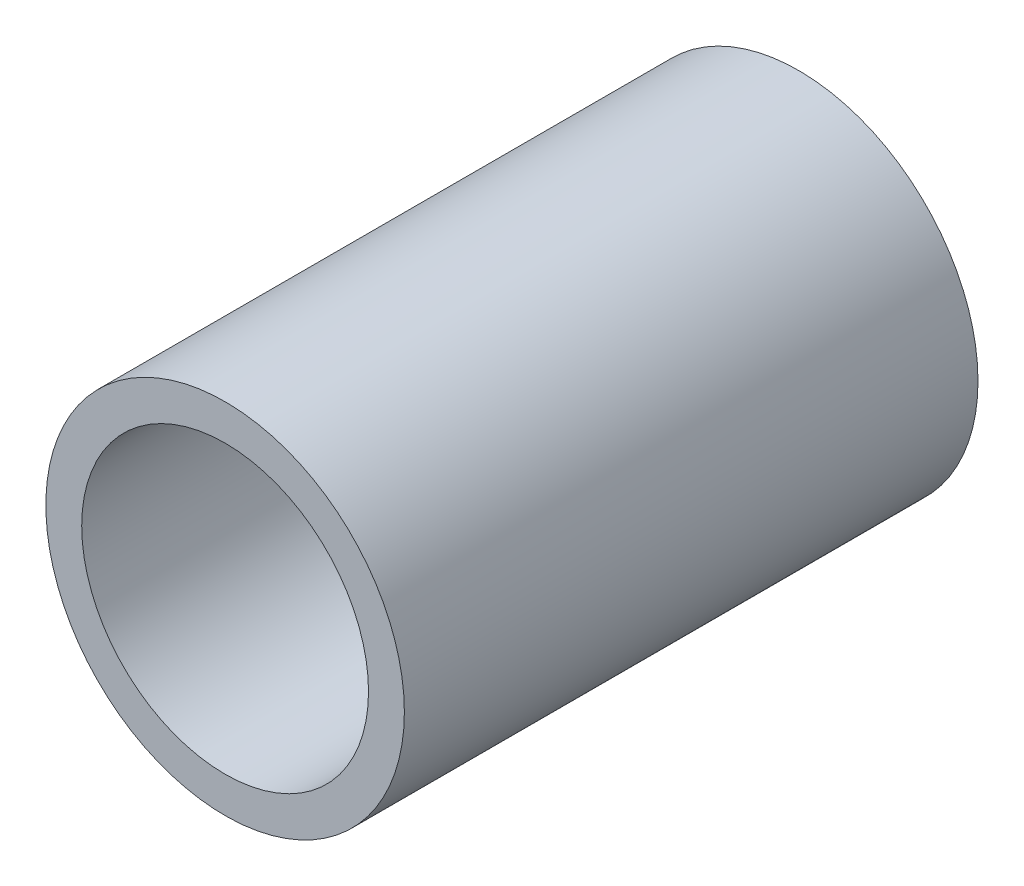
ISO-10303-21;
HEADER;
FILE_DESCRIPTION(('STEP AP214'),'2;1');
FILE_NAME('part.step','',(''),(''),'','','');
FILE_SCHEMA(('AUTOMOTIVE_DESIGN { 1 0 10303 214 1 1 1 1 }'));
ENDSEC;
DATA;
#1=APPLICATION_CONTEXT('core data for automotive mechanical design processes');
#2=APPLICATION_PROTOCOL_DEFINITION('international standard','automotive_design',2000,#1);
#3=PRODUCT_CONTEXT('',#1,'mechanical');
#4=PRODUCT('Part','Part','',(#3));
#5=PRODUCT_RELATED_PRODUCT_CATEGORY('part','',(#4));
#6=PRODUCT_DEFINITION_FORMATION('','',#4);
#7=PRODUCT_DEFINITION_CONTEXT('part definition',#1,'design');
#8=PRODUCT_DEFINITION('design','',#6,#7);
#9=PRODUCT_DEFINITION_SHAPE('','',#8);
#10=(LENGTH_UNIT() NAMED_UNIT(*) SI_UNIT(.MILLI.,.METRE.));
#11=(NAMED_UNIT(*) PLANE_ANGLE_UNIT() SI_UNIT($,.RADIAN.));
#12=(NAMED_UNIT(*) SI_UNIT($,.STERADIAN.) SOLID_ANGLE_UNIT());
#13=UNCERTAINTY_MEASURE_WITH_UNIT(LENGTH_MEASURE(1.E-05),#10,'distance_accuracy_value','');
#14=(GEOMETRIC_REPRESENTATION_CONTEXT(3) GLOBAL_UNCERTAINTY_ASSIGNED_CONTEXT((#13)) GLOBAL_UNIT_ASSIGNED_CONTEXT((#10,
#11,#12)) REPRESENTATION_CONTEXT('',''));
#15=CARTESIAN_POINT('',(0.,0.,0.));
#16=DIRECTION('',(0.,0.,1.));
#17=DIRECTION('',(1.,0.,0.));
#18=AXIS2_PLACEMENT_3D('',#15,#16,#17);
#19=CARTESIAN_POINT('',(0.,0.,12.7));
#20=DIRECTION('',(0.,0.,-1.));
#21=DIRECTION('',(-1.,0.,0.));
#22=AXIS2_PLACEMENT_3D('',#19,#20,#21);
#23=CYLINDRICAL_SURFACE('',#22,3.96875);
#24=CARTESIAN_POINT('',(0.,0.,12.7));
#25=DIRECTION('',(0.,0.,1.));
#26=DIRECTION('',(1.,0.,0.));
#27=AXIS2_PLACEMENT_3D('',#24,#25,#26);
#28=CIRCLE('',#27,3.96875);
#29=CARTESIAN_POINT('',(3.96875,0.,12.7));
#30=VERTEX_POINT('',#29);
#31=EDGE_CURVE('E10',#30,#30,#28,.T.);
#32=ORIENTED_EDGE('',*,*,#31,.F.);
#33=EDGE_LOOP('',(#32));
#34=FACE_BOUND('',#33,.T.);
#35=CARTESIAN_POINT('',(0.,0.,0.));
#36=DIRECTION('',(0.,0.,1.));
#37=DIRECTION('',(1.,0.,0.));
#38=AXIS2_PLACEMENT_3D('',#35,#36,#37);
#39=CIRCLE('',#38,3.96875);
#40=CARTESIAN_POINT('',(3.96875,0.,0.));
#41=VERTEX_POINT('',#40);
#42=EDGE_CURVE('E37',#41,#41,#39,.T.);
#43=ORIENTED_EDGE('',*,*,#42,.T.);
#44=EDGE_LOOP('',(#43));
#45=FACE_BOUND('',#44,.T.);
#46=ADVANCED_FACE('F40',(#34,#45),#23,.T.);
#47=CARTESIAN_POINT('',(0.,0.,12.7));
#48=DIRECTION('',(0.,0.,1.));
#49=DIRECTION('',(1.,0.,0.));
#50=AXIS2_PLACEMENT_3D('',#47,#48,#49);
#51=PLANE('',#50);
#52=CARTESIAN_POINT('',(0.,0.,12.7));
#53=DIRECTION('',(0.,0.,1.));
#54=DIRECTION('',(1.,0.,0.));
#55=AXIS2_PLACEMENT_3D('',#52,#53,#54);
#56=CIRCLE('',#55,3.175);
#57=CARTESIAN_POINT('',(3.175,0.,12.7));
#58=VERTEX_POINT('',#57);
#59=EDGE_CURVE('E47',#58,#58,#56,.T.);
#60=ORIENTED_EDGE('',*,*,#59,.F.);
#61=EDGE_LOOP('',(#60));
#62=FACE_BOUND('',#61,.T.);
#63=ORIENTED_EDGE('',*,*,#31,.T.);
#64=EDGE_LOOP('',(#63));
#65=FACE_BOUND('',#64,.T.);
#66=ADVANCED_FACE('F62',(#62,#65),#51,.T.);
#67=CARTESIAN_POINT('',(0.,0.,0.));
#68=DIRECTION('',(0.,0.,1.));
#69=DIRECTION('',(1.,0.,0.));
#70=AXIS2_PLACEMENT_3D('',#67,#68,#69);
#71=PLANE('',#70);
#72=CARTESIAN_POINT('',(0.,0.,0.));
#73=DIRECTION('',(0.,0.,1.));
#74=DIRECTION('',(1.,0.,0.));
#75=AXIS2_PLACEMENT_3D('',#72,#73,#74);
#76=CIRCLE('',#75,3.175);
#77=CARTESIAN_POINT('',(3.175,0.,0.));
#78=VERTEX_POINT('',#77);
#79=EDGE_CURVE('E50',#78,#78,#76,.T.);
#80=ORIENTED_EDGE('',*,*,#79,.T.);
#81=EDGE_LOOP('',(#80));
#82=FACE_BOUND('',#81,.T.);
#83=ORIENTED_EDGE('',*,*,#42,.F.);
#84=EDGE_LOOP('',(#83));
#85=FACE_BOUND('',#84,.T.);
#86=ADVANCED_FACE('F54',(#82,#85),#71,.F.);
#87=CARTESIAN_POINT('',(0.,0.,0.));
#88=DIRECTION('',(0.,0.,1.));
#89=DIRECTION('',(1.,0.,0.));
#90=AXIS2_PLACEMENT_3D('',#87,#88,#89);
#91=CYLINDRICAL_SURFACE('',#90,3.175);
#92=ORIENTED_EDGE('',*,*,#79,.F.);
#93=EDGE_LOOP('',(#92));
#94=FACE_BOUND('',#93,.T.);
#95=ORIENTED_EDGE('',*,*,#59,.T.);
#96=EDGE_LOOP('',(#95));
#97=FACE_BOUND('',#96,.T.);
#98=ADVANCED_FACE('F59',(#94,#97),#91,.F.);
#99=CLOSED_SHELL('',(#46,#66,#86,#98));
#100=MANIFOLD_SOLID_BREP('B2',#99);
#101=ADVANCED_BREP_SHAPE_REPRESENTATION('',(#18,#100),#14);
#102=SHAPE_DEFINITION_REPRESENTATION(#9,#101);
ENDSEC;
END-ISO-10303-21;
